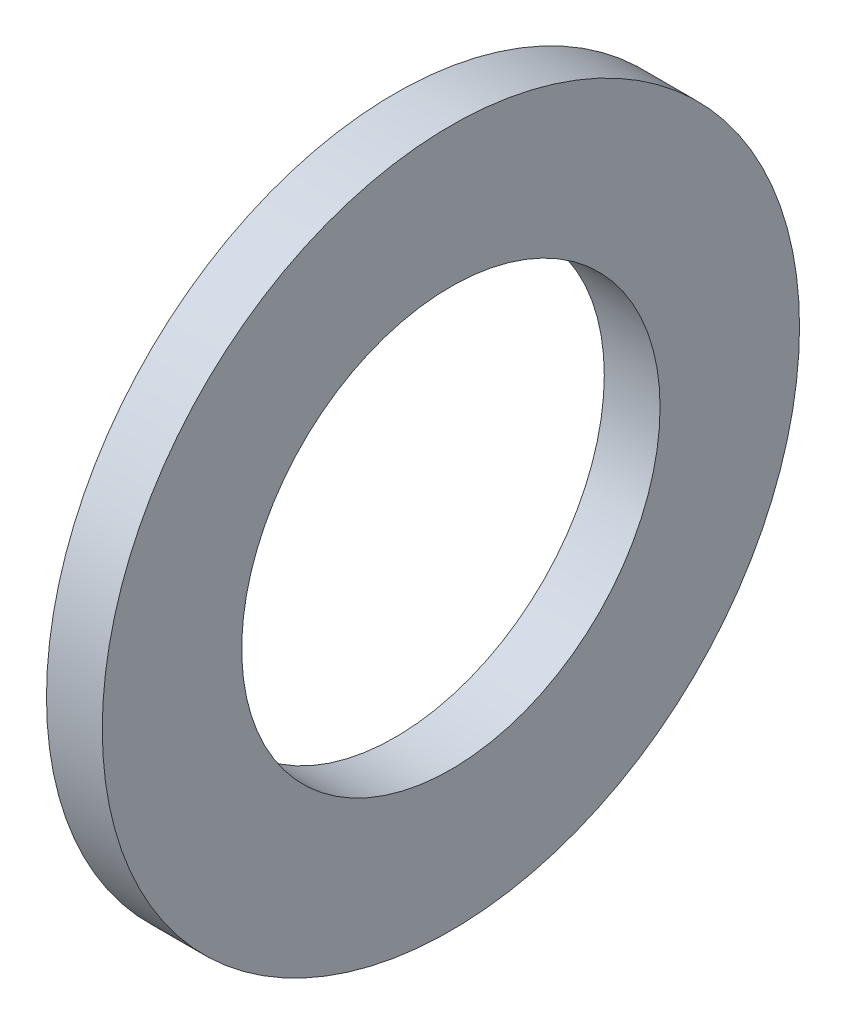
ISO-10303-21;
HEADER;
FILE_DESCRIPTION(('STEP AP214'),'2;1');
FILE_NAME('part.step','',(''),(''),'','','');
FILE_SCHEMA(('AUTOMOTIVE_DESIGN { 1 0 10303 214 1 1 1 1 }'));
ENDSEC;
DATA;
#1=APPLICATION_CONTEXT('core data for automotive mechanical design processes');
#2=APPLICATION_PROTOCOL_DEFINITION('international standard','automotive_design',2000,#1);
#3=PRODUCT_CONTEXT('',#1,'mechanical');
#4=PRODUCT('Part','Part','',(#3));
#5=PRODUCT_RELATED_PRODUCT_CATEGORY('part','',(#4));
#6=PRODUCT_DEFINITION_FORMATION('','',#4);
#7=PRODUCT_DEFINITION_CONTEXT('part definition',#1,'design');
#8=PRODUCT_DEFINITION('design','',#6,#7);
#9=PRODUCT_DEFINITION_SHAPE('','',#8);
#10=(LENGTH_UNIT() NAMED_UNIT(*) SI_UNIT(.MILLI.,.METRE.));
#11=(NAMED_UNIT(*) PLANE_ANGLE_UNIT() SI_UNIT($,.RADIAN.));
#12=(NAMED_UNIT(*) SI_UNIT($,.STERADIAN.) SOLID_ANGLE_UNIT());
#13=UNCERTAINTY_MEASURE_WITH_UNIT(LENGTH_MEASURE(1.E-05),#10,'distance_accuracy_value','');
#14=(GEOMETRIC_REPRESENTATION_CONTEXT(3) GLOBAL_UNCERTAINTY_ASSIGNED_CONTEXT((#13)) GLOBAL_UNIT_ASSIGNED_CONTEXT((#10,
#11,#12)) REPRESENTATION_CONTEXT('',''));
#15=CARTESIAN_POINT('',(0.,0.,0.));
#16=DIRECTION('',(0.,0.,1.));
#17=DIRECTION('',(1.,0.,0.));
#18=AXIS2_PLACEMENT_3D('',#15,#16,#17);
#19=CARTESIAN_POINT('',(1.,0.,0.));
#20=DIRECTION('',(1.,0.,0.));
#21=DIRECTION('',(0.,0.,-1.));
#22=AXIS2_PLACEMENT_3D('',#19,#20,#21);
#23=PLANE('',#22);
#24=CARTESIAN_POINT('',(1.,0.,0.));
#25=DIRECTION('',(1.,0.,0.));
#26=DIRECTION('',(0.,0.,-1.));
#27=AXIS2_PLACEMENT_3D('',#24,#25,#26);
#28=CIRCLE('',#27,12.5);
#29=CARTESIAN_POINT('',(1.,0.,-12.5));
#30=VERTEX_POINT('',#29);
#31=EDGE_CURVE('E10',#30,#30,#28,.T.);
#32=ORIENTED_EDGE('',*,*,#31,.T.);
#33=EDGE_LOOP('',(#32));
#34=FACE_BOUND('',#33,.T.);
#35=CARTESIAN_POINT('',(1.,0.,0.));
#36=DIRECTION('',(1.,0.,0.));
#37=DIRECTION('',(0.,0.,-1.));
#38=AXIS2_PLACEMENT_3D('',#35,#36,#37);
#39=CIRCLE('',#38,7.5);
#40=CARTESIAN_POINT('',(1.,0.,-7.5));
#41=VERTEX_POINT('',#40);
#42=EDGE_CURVE('E42',#41,#41,#39,.T.);
#43=ORIENTED_EDGE('',*,*,#42,.F.);
#44=EDGE_LOOP('',(#43));
#45=FACE_BOUND('',#44,.T.);
#46=ADVANCED_FACE('F31',(#34,#45),#23,.T.);
#47=CARTESIAN_POINT('',(-1.,0.,0.));
#48=DIRECTION('',(1.,0.,0.));
#49=DIRECTION('',(0.,0.,-1.));
#50=AXIS2_PLACEMENT_3D('',#47,#48,#49);
#51=PLANE('',#50);
#52=CARTESIAN_POINT('',(-1.,0.,0.));
#53=DIRECTION('',(1.,0.,0.));
#54=DIRECTION('',(0.,0.,-1.));
#55=AXIS2_PLACEMENT_3D('',#52,#53,#54);
#56=CIRCLE('',#55,12.5);
#57=CARTESIAN_POINT('',(-1.,0.,-12.5));
#58=VERTEX_POINT('',#57);
#59=EDGE_CURVE('E35',#58,#58,#56,.T.);
#60=ORIENTED_EDGE('',*,*,#59,.F.);
#61=EDGE_LOOP('',(#60));
#62=FACE_BOUND('',#61,.T.);
#63=CARTESIAN_POINT('',(-1.,0.,0.));
#64=DIRECTION('',(1.,0.,0.));
#65=DIRECTION('',(0.,0.,-1.));
#66=AXIS2_PLACEMENT_3D('',#63,#64,#65);
#67=CIRCLE('',#66,7.5);
#68=CARTESIAN_POINT('',(-1.,0.,-7.5));
#69=VERTEX_POINT('',#68);
#70=EDGE_CURVE('E44',#69,#69,#67,.T.);
#71=ORIENTED_EDGE('',*,*,#70,.T.);
#72=EDGE_LOOP('',(#71));
#73=FACE_BOUND('',#72,.T.);
#74=ADVANCED_FACE('F54',(#62,#73),#51,.F.);
#75=CARTESIAN_POINT('',(1.,0.,0.));
#76=DIRECTION('',(-1.,0.,0.));
#77=DIRECTION('',(0.,0.,1.));
#78=AXIS2_PLACEMENT_3D('',#75,#76,#77);
#79=CYLINDRICAL_SURFACE('',#78,12.5);
#80=ORIENTED_EDGE('',*,*,#31,.F.);
#81=EDGE_LOOP('',(#80));
#82=FACE_BOUND('',#81,.T.);
#83=ORIENTED_EDGE('',*,*,#59,.T.);
#84=EDGE_LOOP('',(#83));
#85=FACE_BOUND('',#84,.T.);
#86=ADVANCED_FACE('F33',(#82,#85),#79,.T.);
#87=CARTESIAN_POINT('',(1.,0.,0.));
#88=DIRECTION('',(-1.,0.,0.));
#89=DIRECTION('',(0.,0.,1.));
#90=AXIS2_PLACEMENT_3D('',#87,#88,#89);
#91=CYLINDRICAL_SURFACE('',#90,7.5);
#92=ORIENTED_EDGE('',*,*,#42,.T.);
#93=EDGE_LOOP('',(#92));
#94=FACE_BOUND('',#93,.T.);
#95=ORIENTED_EDGE('',*,*,#70,.F.);
#96=EDGE_LOOP('',(#95));
#97=FACE_BOUND('',#96,.T.);
#98=ADVANCED_FACE('F50',(#94,#97),#91,.F.);
#99=CLOSED_SHELL('',(#46,#74,#86,#98));
#100=MANIFOLD_SOLID_BREP('B2',#99);
#101=ADVANCED_BREP_SHAPE_REPRESENTATION('',(#18,#100),#14);
#102=SHAPE_DEFINITION_REPRESENTATION(#9,#101);
ENDSEC;
END-ISO-10303-21;
